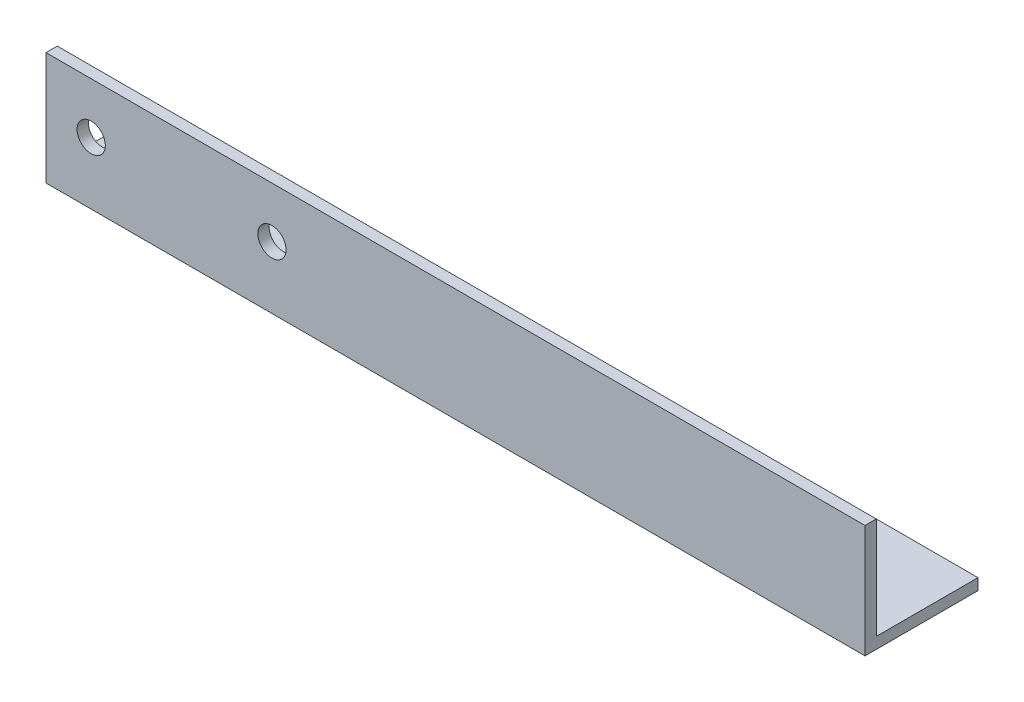
ISO-10303-21;
HEADER;
FILE_DESCRIPTION(('STEP AP214'),'2;1');
FILE_NAME('part.step','',(''),(''),'','','');
FILE_SCHEMA(('AUTOMOTIVE_DESIGN { 1 0 10303 214 1 1 1 1 }'));
ENDSEC;
DATA;
#1=APPLICATION_CONTEXT('core data for automotive mechanical design processes');
#2=APPLICATION_PROTOCOL_DEFINITION('international standard','automotive_design',2000,#1);
#3=PRODUCT_CONTEXT('',#1,'mechanical');
#4=PRODUCT('Part','Part','',(#3));
#5=PRODUCT_RELATED_PRODUCT_CATEGORY('part','',(#4));
#6=PRODUCT_DEFINITION_FORMATION('','',#4);
#7=PRODUCT_DEFINITION_CONTEXT('part definition',#1,'design');
#8=PRODUCT_DEFINITION('design','',#6,#7);
#9=PRODUCT_DEFINITION_SHAPE('','',#8);
#10=(LENGTH_UNIT() NAMED_UNIT(*) SI_UNIT(.MILLI.,.METRE.));
#11=(NAMED_UNIT(*) PLANE_ANGLE_UNIT() SI_UNIT($,.RADIAN.));
#12=(NAMED_UNIT(*) SI_UNIT($,.STERADIAN.) SOLID_ANGLE_UNIT());
#13=UNCERTAINTY_MEASURE_WITH_UNIT(LENGTH_MEASURE(1.E-05),#10,'distance_accuracy_value','');
#14=(GEOMETRIC_REPRESENTATION_CONTEXT(3) GLOBAL_UNCERTAINTY_ASSIGNED_CONTEXT((#13)) GLOBAL_UNIT_ASSIGNED_CONTEXT((#10,
#11,#12)) REPRESENTATION_CONTEXT('',''));
#15=CARTESIAN_POINT('',(0.,0.,0.));
#16=DIRECTION('',(0.,0.,1.));
#17=DIRECTION('',(1.,0.,0.));
#18=AXIS2_PLACEMENT_3D('',#15,#16,#17);
#19=CARTESIAN_POINT('',(145.,20.,-2.));
#20=DIRECTION('',(0.,-1.,0.));
#21=DIRECTION('',(0.,0.,-1.));
#22=AXIS2_PLACEMENT_3D('',#19,#20,#21);
#23=PLANE('',#22);
#24=DIRECTION('',(0.,0.,1.));
#25=VECTOR('',#24,1.);
#26=CARTESIAN_POINT('',(0.,20.,-2.));
#27=LINE('',#26,#25);
#28=CARTESIAN_POINT('',(0.,20.,-2.));
#29=VERTEX_POINT('',#28);
#30=CARTESIAN_POINT('',(0.,20.,0.));
#31=VERTEX_POINT('',#30);
#32=EDGE_CURVE('E132',#29,#31,#27,.T.);
#33=ORIENTED_EDGE('',*,*,#32,.T.);
#34=DIRECTION('',(-1.,0.,0.));
#35=VECTOR('',#34,1.);
#36=CARTESIAN_POINT('',(145.,20.,0.));
#37=LINE('',#36,#35);
#38=CARTESIAN_POINT('',(145.,20.,0.));
#39=VERTEX_POINT('',#38);
#40=EDGE_CURVE('E11',#39,#31,#37,.T.);
#41=ORIENTED_EDGE('',*,*,#40,.F.);
#42=DIRECTION('',(0.,0.,1.));
#43=VECTOR('',#42,1.);
#44=CARTESIAN_POINT('',(145.,20.,-2.));
#45=LINE('',#44,#43);
#46=CARTESIAN_POINT('',(145.,20.,-2.));
#47=VERTEX_POINT('',#46);
#48=EDGE_CURVE('E149',#47,#39,#45,.T.);
#49=ORIENTED_EDGE('',*,*,#48,.F.);
#50=DIRECTION('',(-1.,0.,0.));
#51=VECTOR('',#50,1.);
#52=CARTESIAN_POINT('',(145.,20.,-2.));
#53=LINE('',#52,#51);
#54=EDGE_CURVE('E128',#47,#29,#53,.T.);
#55=ORIENTED_EDGE('',*,*,#54,.T.);
#56=EDGE_LOOP('',(#33,#41,#49,#55));
#57=FACE_BOUND('',#56,.T.);
#58=ADVANCED_FACE('F43',(#57),#23,.F.);
#59=CARTESIAN_POINT('',(145.,20.,0.));
#60=DIRECTION('',(0.,0.,-1.));
#61=DIRECTION('',(-1.,0.,0.));
#62=AXIS2_PLACEMENT_3D('',#59,#60,#61);
#63=PLANE('',#62);
#64=CARTESIAN_POINT('',(8.,11.,0.));
#65=DIRECTION('',(0.,0.,-1.));
#66=DIRECTION('',(0.,1.,0.));
#67=AXIS2_PLACEMENT_3D('',#64,#65,#66);
#68=CIRCLE('',#67,2.5);
#69=CARTESIAN_POINT('',(8.,13.5,0.));
#70=VERTEX_POINT('',#69);
#71=EDGE_CURVE('E137',#70,#70,#68,.T.);
#72=ORIENTED_EDGE('',*,*,#71,.T.);
#73=EDGE_LOOP('',(#72));
#74=FACE_BOUND('',#73,.T.);
#75=CARTESIAN_POINT('',(40.,11.,0.));
#76=DIRECTION('',(0.,0.,-1.));
#77=DIRECTION('',(0.,1.,0.));
#78=AXIS2_PLACEMENT_3D('',#75,#76,#77);
#79=CIRCLE('',#78,2.5);
#80=CARTESIAN_POINT('',(40.,13.5,0.));
#81=VERTEX_POINT('',#80);
#82=EDGE_CURVE('E287',#81,#81,#79,.T.);
#83=ORIENTED_EDGE('',*,*,#82,.T.);
#84=EDGE_LOOP('',(#83));
#85=FACE_BOUND('',#84,.T.);
#86=DIRECTION('',(0.,-1.,0.));
#87=VECTOR('',#86,1.);
#88=CARTESIAN_POINT('',(0.,20.,0.));
#89=LINE('',#88,#87);
#90=CARTESIAN_POINT('',(0.,0.,0.));
#91=VERTEX_POINT('',#90);
#92=EDGE_CURVE('E136',#31,#91,#89,.T.);
#93=ORIENTED_EDGE('',*,*,#92,.T.);
#94=DIRECTION('',(-1.,0.,0.));
#95=VECTOR('',#94,1.);
#96=CARTESIAN_POINT('',(145.,0.,0.));
#97=LINE('',#96,#95);
#98=CARTESIAN_POINT('',(145.,0.,0.));
#99=VERTEX_POINT('',#98);
#100=EDGE_CURVE('E52',#99,#91,#97,.T.);
#101=ORIENTED_EDGE('',*,*,#100,.F.);
#102=DIRECTION('',(0.,-1.,0.));
#103=VECTOR('',#102,1.);
#104=CARTESIAN_POINT('',(145.,20.,0.));
#105=LINE('',#104,#103);
#106=EDGE_CURVE('E97',#39,#99,#105,.T.);
#107=ORIENTED_EDGE('',*,*,#106,.F.);
#108=ORIENTED_EDGE('',*,*,#40,.T.);
#109=EDGE_LOOP('',(#93,#101,#107,#108));
#110=FACE_BOUND('',#109,.T.);
#111=ADVANCED_FACE('F180',(#74,#85,#110),#63,.F.);
#112=CARTESIAN_POINT('',(145.,0.,0.));
#113=DIRECTION('',(0.,1.,0.));
#114=DIRECTION('',(0.,0.,1.));
#115=AXIS2_PLACEMENT_3D('',#112,#113,#114);
#116=PLANE('',#115);
#117=DIRECTION('',(0.,0.,-1.));
#118=VECTOR('',#117,1.);
#119=CARTESIAN_POINT('',(0.,0.,0.));
#120=LINE('',#119,#118);
#121=CARTESIAN_POINT('',(0.,0.,-20.));
#122=VERTEX_POINT('',#121);
#123=EDGE_CURVE('E140',#91,#122,#120,.T.);
#124=ORIENTED_EDGE('',*,*,#123,.T.);
#125=DIRECTION('',(-1.,0.,0.));
#126=VECTOR('',#125,1.);
#127=CARTESIAN_POINT('',(145.,0.,-20.));
#128=LINE('',#127,#126);
#129=CARTESIAN_POINT('',(145.,0.,-20.));
#130=VERTEX_POINT('',#129);
#131=EDGE_CURVE('E121',#130,#122,#128,.T.);
#132=ORIENTED_EDGE('',*,*,#131,.F.);
#133=DIRECTION('',(0.,0.,-1.));
#134=VECTOR('',#133,1.);
#135=CARTESIAN_POINT('',(145.,0.,0.));
#136=LINE('',#135,#134);
#137=EDGE_CURVE('E110',#99,#130,#136,.T.);
#138=ORIENTED_EDGE('',*,*,#137,.F.);
#139=ORIENTED_EDGE('',*,*,#100,.T.);
#140=EDGE_LOOP('',(#124,#132,#138,#139));
#141=FACE_BOUND('',#140,.T.);
#142=ADVANCED_FACE('F159',(#141),#116,.F.);
#143=CARTESIAN_POINT('',(145.,0.,-20.));
#144=DIRECTION('',(0.,0.,1.));
#145=DIRECTION('',(1.,0.,0.));
#146=AXIS2_PLACEMENT_3D('',#143,#144,#145);
#147=PLANE('',#146);
#148=DIRECTION('',(0.,1.,0.));
#149=VECTOR('',#148,1.);
#150=CARTESIAN_POINT('',(0.,0.,-20.));
#151=LINE('',#150,#149);
#152=CARTESIAN_POINT('',(0.,2.,-20.));
#153=VERTEX_POINT('',#152);
#154=EDGE_CURVE('E119',#122,#153,#151,.T.);
#155=ORIENTED_EDGE('',*,*,#154,.T.);
#156=DIRECTION('',(-1.,0.,0.));
#157=VECTOR('',#156,1.);
#158=CARTESIAN_POINT('',(145.,2.,-20.));
#159=LINE('',#158,#157);
#160=CARTESIAN_POINT('',(145.,2.,-20.));
#161=VERTEX_POINT('',#160);
#162=EDGE_CURVE('E116',#161,#153,#159,.T.);
#163=ORIENTED_EDGE('',*,*,#162,.F.);
#164=DIRECTION('',(0.,1.,0.));
#165=VECTOR('',#164,1.);
#166=CARTESIAN_POINT('',(145.,0.,-20.));
#167=LINE('',#166,#165);
#168=EDGE_CURVE('E104',#130,#161,#167,.T.);
#169=ORIENTED_EDGE('',*,*,#168,.F.);
#170=ORIENTED_EDGE('',*,*,#131,.T.);
#171=EDGE_LOOP('',(#155,#163,#169,#170));
#172=FACE_BOUND('',#171,.T.);
#173=ADVANCED_FACE('F117',(#172),#147,.F.);
#174=CARTESIAN_POINT('',(145.,2.,-20.));
#175=DIRECTION('',(0.,-1.,0.));
#176=DIRECTION('',(0.,0.,-1.));
#177=AXIS2_PLACEMENT_3D('',#174,#175,#176);
#178=PLANE('',#177);
#179=DIRECTION('',(0.,0.,1.));
#180=VECTOR('',#179,1.);
#181=CARTESIAN_POINT('',(0.,2.,-20.));
#182=LINE('',#181,#180);
#183=CARTESIAN_POINT('',(0.,2.,-2.));
#184=VERTEX_POINT('',#183);
#185=EDGE_CURVE('E83',#153,#184,#182,.T.);
#186=ORIENTED_EDGE('',*,*,#185,.T.);
#187=DIRECTION('',(-1.,0.,0.));
#188=VECTOR('',#187,1.);
#189=CARTESIAN_POINT('',(145.,2.,-2.));
#190=LINE('',#189,#188);
#191=CARTESIAN_POINT('',(145.,2.,-2.));
#192=VERTEX_POINT('',#191);
#193=EDGE_CURVE('E122',#192,#184,#190,.T.);
#194=ORIENTED_EDGE('',*,*,#193,.F.);
#195=DIRECTION('',(0.,0.,1.));
#196=VECTOR('',#195,1.);
#197=CARTESIAN_POINT('',(145.,2.,-20.));
#198=LINE('',#197,#196);
#199=EDGE_CURVE('E108',#161,#192,#198,.T.);
#200=ORIENTED_EDGE('',*,*,#199,.F.);
#201=ORIENTED_EDGE('',*,*,#162,.T.);
#202=EDGE_LOOP('',(#186,#194,#200,#201));
#203=FACE_BOUND('',#202,.T.);
#204=ADVANCED_FACE('F124',(#203),#178,.F.);
#205=CARTESIAN_POINT('',(145.,2.,-2.));
#206=DIRECTION('',(0.,0.,1.));
#207=DIRECTION('',(0.,-1.,0.));
#208=AXIS2_PLACEMENT_3D('',#205,#206,#207);
#209=PLANE('',#208);
#210=CARTESIAN_POINT('',(8.,11.,-2.));
#211=DIRECTION('',(0.,0.,-1.));
#212=DIRECTION('',(0.,1.,0.));
#213=AXIS2_PLACEMENT_3D('',#210,#211,#212);
#214=CIRCLE('',#213,2.5);
#215=CARTESIAN_POINT('',(8.,13.5,-2.));
#216=VERTEX_POINT('',#215);
#217=EDGE_CURVE('E279',#216,#216,#214,.T.);
#218=ORIENTED_EDGE('',*,*,#217,.F.);
#219=EDGE_LOOP('',(#218));
#220=FACE_BOUND('',#219,.T.);
#221=CARTESIAN_POINT('',(40.,11.,-2.));
#222=DIRECTION('',(0.,0.,-1.));
#223=DIRECTION('',(0.,1.,0.));
#224=AXIS2_PLACEMENT_3D('',#221,#222,#223);
#225=CIRCLE('',#224,2.5);
#226=CARTESIAN_POINT('',(40.,13.5,-2.));
#227=VERTEX_POINT('',#226);
#228=EDGE_CURVE('E281',#227,#227,#225,.T.);
#229=ORIENTED_EDGE('',*,*,#228,.F.);
#230=EDGE_LOOP('',(#229));
#231=FACE_BOUND('',#230,.T.);
#232=DIRECTION('',(0.,1.,0.));
#233=VECTOR('',#232,1.);
#234=CARTESIAN_POINT('',(0.,2.,-2.));
#235=LINE('',#234,#233);
#236=EDGE_CURVE('E89',#184,#29,#235,.T.);
#237=ORIENTED_EDGE('',*,*,#236,.T.);
#238=ORIENTED_EDGE('',*,*,#54,.F.);
#239=DIRECTION('',(0.,1.,0.));
#240=VECTOR('',#239,1.);
#241=CARTESIAN_POINT('',(145.,2.,-2.));
#242=LINE('',#241,#240);
#243=EDGE_CURVE('E60',#192,#47,#242,.T.);
#244=ORIENTED_EDGE('',*,*,#243,.F.);
#245=ORIENTED_EDGE('',*,*,#193,.T.);
#246=EDGE_LOOP('',(#237,#238,#244,#245));
#247=FACE_BOUND('',#246,.T.);
#248=ADVANCED_FACE('F166',(#220,#231,#247),#209,.F.);
#249=CARTESIAN_POINT('',(145.,0.,0.));
#250=DIRECTION('',(1.,0.,0.));
#251=DIRECTION('',(0.,0.,-1.));
#252=AXIS2_PLACEMENT_3D('',#249,#250,#251);
#253=PLANE('',#252);
#254=ORIENTED_EDGE('',*,*,#48,.T.);
#255=ORIENTED_EDGE('',*,*,#106,.T.);
#256=ORIENTED_EDGE('',*,*,#137,.T.);
#257=ORIENTED_EDGE('',*,*,#168,.T.);
#258=ORIENTED_EDGE('',*,*,#199,.T.);
#259=ORIENTED_EDGE('',*,*,#243,.T.);
#260=EDGE_LOOP('',(#254,#255,#256,#257,#258,#259));
#261=FACE_BOUND('',#260,.T.);
#262=ADVANCED_FACE('F106',(#261),#253,.T.);
#263=CARTESIAN_POINT('',(0.,0.,0.));
#264=DIRECTION('',(1.,0.,0.));
#265=DIRECTION('',(0.,0.,-1.));
#266=AXIS2_PLACEMENT_3D('',#263,#264,#265);
#267=PLANE('',#266);
#268=ORIENTED_EDGE('',*,*,#32,.F.);
#269=ORIENTED_EDGE('',*,*,#236,.F.);
#270=ORIENTED_EDGE('',*,*,#185,.F.);
#271=ORIENTED_EDGE('',*,*,#154,.F.);
#272=ORIENTED_EDGE('',*,*,#123,.F.);
#273=ORIENTED_EDGE('',*,*,#92,.F.);
#274=EDGE_LOOP('',(#268,#269,#270,#271,#272,#273));
#275=FACE_BOUND('',#274,.T.);
#276=ADVANCED_FACE('F162',(#275),#267,.F.);
#277=CARTESIAN_POINT('',(40.,11.,0.));
#278=DIRECTION('',(0.,0.,-1.));
#279=DIRECTION('',(0.,1.,0.));
#280=AXIS2_PLACEMENT_3D('',#277,#278,#279);
#281=CYLINDRICAL_SURFACE('',#280,2.5);
#282=ORIENTED_EDGE('',*,*,#82,.F.);
#283=EDGE_LOOP('',(#282));
#284=FACE_BOUND('',#283,.T.);
#285=ORIENTED_EDGE('',*,*,#228,.T.);
#286=EDGE_LOOP('',(#285));
#287=FACE_BOUND('',#286,.T.);
#288=ADVANCED_FACE('F218',(#284,#287),#281,.F.);
#289=CARTESIAN_POINT('',(8.,11.,0.));
#290=DIRECTION('',(0.,0.,-1.));
#291=DIRECTION('',(0.,1.,0.));
#292=AXIS2_PLACEMENT_3D('',#289,#290,#291);
#293=CYLINDRICAL_SURFACE('',#292,2.5);
#294=ORIENTED_EDGE('',*,*,#71,.F.);
#295=EDGE_LOOP('',(#294));
#296=FACE_BOUND('',#295,.T.);
#297=ORIENTED_EDGE('',*,*,#217,.T.);
#298=EDGE_LOOP('',(#297));
#299=FACE_BOUND('',#298,.T.);
#300=ADVANCED_FACE('F239',(#296,#299),#293,.F.);
#301=CLOSED_SHELL('',(#58,#111,#142,#173,#204,#248,#262,#276,#288,#300));
#302=MANIFOLD_SOLID_BREP('B2',#301);
#303=ADVANCED_BREP_SHAPE_REPRESENTATION('',(#18,#302),#14);
#304=SHAPE_DEFINITION_REPRESENTATION(#9,#303);
ENDSEC;
END-ISO-10303-21;
